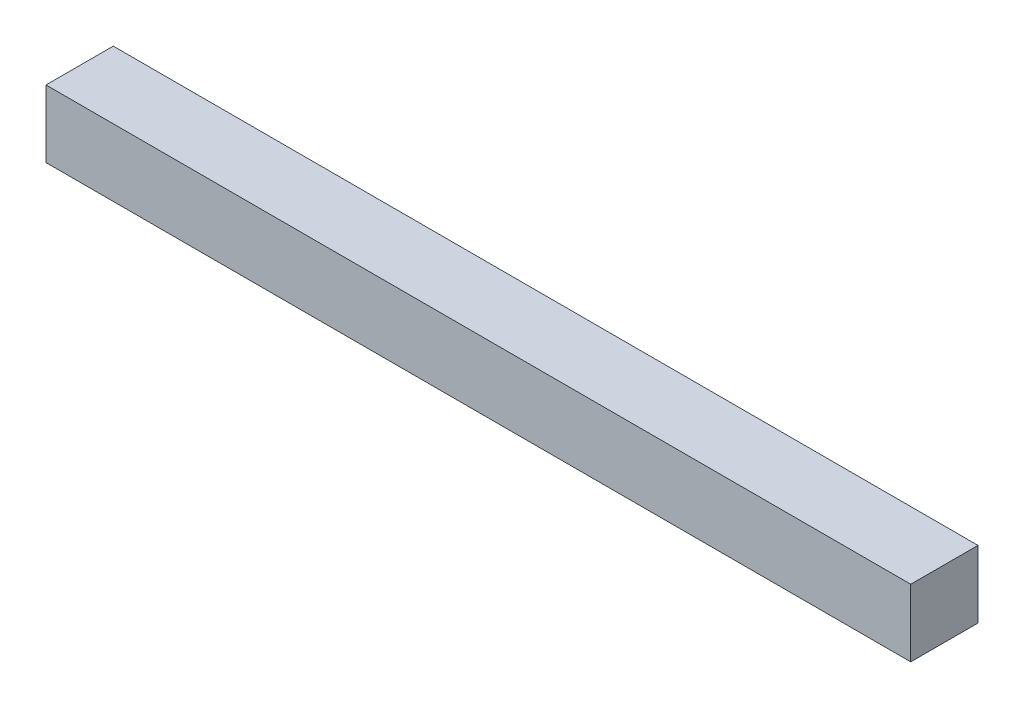
ISO-10303-21;
HEADER;
FILE_DESCRIPTION(('STEP AP214'),'2;1');
FILE_NAME('part.step','',(''),(''),'','','');
FILE_SCHEMA(('AUTOMOTIVE_DESIGN { 1 0 10303 214 1 1 1 1 }'));
ENDSEC;
DATA;
#1=APPLICATION_CONTEXT('core data for automotive mechanical design processes');
#2=APPLICATION_PROTOCOL_DEFINITION('international standard','automotive_design',2000,#1);
#3=PRODUCT_CONTEXT('',#1,'mechanical');
#4=PRODUCT('Part','Part','',(#3));
#5=PRODUCT_RELATED_PRODUCT_CATEGORY('part','',(#4));
#6=PRODUCT_DEFINITION_FORMATION('','',#4);
#7=PRODUCT_DEFINITION_CONTEXT('part definition',#1,'design');
#8=PRODUCT_DEFINITION('design','',#6,#7);
#9=PRODUCT_DEFINITION_SHAPE('','',#8);
#10=(LENGTH_UNIT() NAMED_UNIT(*) SI_UNIT(.MILLI.,.METRE.));
#11=(NAMED_UNIT(*) PLANE_ANGLE_UNIT() SI_UNIT($,.RADIAN.));
#12=(NAMED_UNIT(*) SI_UNIT($,.STERADIAN.) SOLID_ANGLE_UNIT());
#13=UNCERTAINTY_MEASURE_WITH_UNIT(LENGTH_MEASURE(1.E-05),#10,'distance_accuracy_value','');
#14=(GEOMETRIC_REPRESENTATION_CONTEXT(3) GLOBAL_UNCERTAINTY_ASSIGNED_CONTEXT((#13)) GLOBAL_UNIT_ASSIGNED_CONTEXT((#10,
#11,#12)) REPRESENTATION_CONTEXT('',''));
#15=CARTESIAN_POINT('',(0.,0.,0.));
#16=DIRECTION('',(0.,0.,1.));
#17=DIRECTION('',(1.,0.,0.));
#18=AXIS2_PLACEMENT_3D('',#15,#16,#17);
#19=CARTESIAN_POINT('',(326.5693928594,12.7,-12.7));
#20=DIRECTION('',(0.,0.,1.));
#21=DIRECTION('',(0.,-1.,0.));
#22=AXIS2_PLACEMENT_3D('',#19,#20,#21);
#23=PLANE('',#22);
#24=DIRECTION('',(0.,1.,0.));
#25=VECTOR('',#24,1.);
#26=CARTESIAN_POINT('',(0.,12.7,-12.7));
#27=LINE('',#26,#25);
#28=CARTESIAN_POINT('',(0.,-12.7,-12.7));
#29=VERTEX_POINT('',#28);
#30=CARTESIAN_POINT('',(0.,12.7,-12.7));
#31=VERTEX_POINT('',#30);
#32=EDGE_CURVE('E100',#29,#31,#27,.T.);
#33=ORIENTED_EDGE('',*,*,#32,.T.);
#34=DIRECTION('',(-1.,0.,0.));
#35=VECTOR('',#34,1.);
#36=CARTESIAN_POINT('',(326.5693928594,12.7,-12.7));
#37=LINE('',#36,#35);
#38=CARTESIAN_POINT('',(326.5693928594,12.7,-12.7));
#39=VERTEX_POINT('',#38);
#40=EDGE_CURVE('E11',#39,#31,#37,.T.);
#41=ORIENTED_EDGE('',*,*,#40,.F.);
#42=DIRECTION('',(0.,1.,0.));
#43=VECTOR('',#42,1.);
#44=CARTESIAN_POINT('',(326.5693928594,12.7,-12.7));
#45=LINE('',#44,#43);
#46=CARTESIAN_POINT('',(326.5693928594,-12.7,-12.7));
#47=VERTEX_POINT('',#46);
#48=EDGE_CURVE('E88',#47,#39,#45,.T.);
#49=ORIENTED_EDGE('',*,*,#48,.F.);
#50=DIRECTION('',(-1.,0.,0.));
#51=VECTOR('',#50,1.);
#52=CARTESIAN_POINT('',(326.5693928594,-12.7,-12.7));
#53=LINE('',#52,#51);
#54=EDGE_CURVE('E96',#47,#29,#53,.T.);
#55=ORIENTED_EDGE('',*,*,#54,.T.);
#56=EDGE_LOOP('',(#33,#41,#49,#55));
#57=FACE_BOUND('',#56,.T.);
#58=ADVANCED_FACE('F37',(#57),#23,.F.);
#59=CARTESIAN_POINT('',(326.5693928594,12.7,12.7));
#60=DIRECTION('',(0.,-1.,0.));
#61=DIRECTION('',(0.,0.,-1.));
#62=AXIS2_PLACEMENT_3D('',#59,#60,#61);
#63=PLANE('',#62);
#64=DIRECTION('',(0.,0.,1.));
#65=VECTOR('',#64,1.);
#66=CARTESIAN_POINT('',(0.,12.7,12.7));
#67=LINE('',#66,#65);
#68=CARTESIAN_POINT('',(0.,12.7,12.7));
#69=VERTEX_POINT('',#68);
#70=EDGE_CURVE('E92',#31,#69,#67,.T.);
#71=ORIENTED_EDGE('',*,*,#70,.T.);
#72=DIRECTION('',(-1.,0.,0.));
#73=VECTOR('',#72,1.);
#74=CARTESIAN_POINT('',(326.5693928594,12.7,12.7));
#75=LINE('',#74,#73);
#76=CARTESIAN_POINT('',(326.5693928594,12.7,12.7));
#77=VERTEX_POINT('',#76);
#78=EDGE_CURVE('E45',#77,#69,#75,.T.);
#79=ORIENTED_EDGE('',*,*,#78,.F.);
#80=DIRECTION('',(0.,0.,1.));
#81=VECTOR('',#80,1.);
#82=CARTESIAN_POINT('',(326.5693928594,12.7,12.7));
#83=LINE('',#82,#81);
#84=EDGE_CURVE('E83',#39,#77,#83,.T.);
#85=ORIENTED_EDGE('',*,*,#84,.F.);
#86=ORIENTED_EDGE('',*,*,#40,.T.);
#87=EDGE_LOOP('',(#71,#79,#85,#86));
#88=FACE_BOUND('',#87,.T.);
#89=ADVANCED_FACE('F91',(#88),#63,.F.);
#90=CARTESIAN_POINT('',(326.5693928594,12.7,12.7));
#91=DIRECTION('',(0.,0.,-1.));
#92=DIRECTION('',(0.,1.,0.));
#93=AXIS2_PLACEMENT_3D('',#90,#91,#92);
#94=PLANE('',#93);
#95=DIRECTION('',(0.,-1.,0.));
#96=VECTOR('',#95,1.);
#97=CARTESIAN_POINT('',(0.,12.7,12.7));
#98=LINE('',#97,#96);
#99=CARTESIAN_POINT('',(0.,-12.7,12.7));
#100=VERTEX_POINT('',#99);
#101=EDGE_CURVE('E70',#69,#100,#98,.T.);
#102=ORIENTED_EDGE('',*,*,#101,.T.);
#103=DIRECTION('',(-1.,0.,0.));
#104=VECTOR('',#103,1.);
#105=CARTESIAN_POINT('',(326.5693928594,-12.7,12.7));
#106=LINE('',#105,#104);
#107=CARTESIAN_POINT('',(326.5693928594,-12.7,12.7));
#108=VERTEX_POINT('',#107);
#109=EDGE_CURVE('E93',#108,#100,#106,.T.);
#110=ORIENTED_EDGE('',*,*,#109,.F.);
#111=DIRECTION('',(0.,-1.,0.));
#112=VECTOR('',#111,1.);
#113=CARTESIAN_POINT('',(326.5693928594,12.7,12.7));
#114=LINE('',#113,#112);
#115=EDGE_CURVE('E86',#77,#108,#114,.T.);
#116=ORIENTED_EDGE('',*,*,#115,.F.);
#117=ORIENTED_EDGE('',*,*,#78,.T.);
#118=EDGE_LOOP('',(#102,#110,#116,#117));
#119=FACE_BOUND('',#118,.T.);
#120=ADVANCED_FACE('F94',(#119),#94,.F.);
#121=CARTESIAN_POINT('',(326.5693928594,-12.7,12.7));
#122=DIRECTION('',(0.,1.,0.));
#123=DIRECTION('',(0.,0.,1.));
#124=AXIS2_PLACEMENT_3D('',#121,#122,#123);
#125=PLANE('',#124);
#126=DIRECTION('',(0.,0.,-1.));
#127=VECTOR('',#126,1.);
#128=CARTESIAN_POINT('',(0.,-12.7,12.7));
#129=LINE('',#128,#127);
#130=EDGE_CURVE('E76',#100,#29,#129,.T.);
#131=ORIENTED_EDGE('',*,*,#130,.T.);
#132=ORIENTED_EDGE('',*,*,#54,.F.);
#133=DIRECTION('',(0.,0.,-1.));
#134=VECTOR('',#133,1.);
#135=CARTESIAN_POINT('',(326.5693928594,-12.7,12.7));
#136=LINE('',#135,#134);
#137=EDGE_CURVE('E53',#108,#47,#136,.T.);
#138=ORIENTED_EDGE('',*,*,#137,.F.);
#139=ORIENTED_EDGE('',*,*,#109,.T.);
#140=EDGE_LOOP('',(#131,#132,#138,#139));
#141=FACE_BOUND('',#140,.T.);
#142=ADVANCED_FACE('F107',(#141),#125,.F.);
#143=CARTESIAN_POINT('',(326.5693928594,0.,0.));
#144=DIRECTION('',(1.,0.,0.));
#145=DIRECTION('',(0.,0.,-1.));
#146=AXIS2_PLACEMENT_3D('',#143,#144,#145);
#147=PLANE('',#146);
#148=ORIENTED_EDGE('',*,*,#48,.T.);
#149=ORIENTED_EDGE('',*,*,#84,.T.);
#150=ORIENTED_EDGE('',*,*,#115,.T.);
#151=ORIENTED_EDGE('',*,*,#137,.T.);
#152=EDGE_LOOP('',(#148,#149,#150,#151));
#153=FACE_BOUND('',#152,.T.);
#154=ADVANCED_FACE('F84',(#153),#147,.T.);
#155=CARTESIAN_POINT('',(0.,0.,0.));
#156=DIRECTION('',(1.,0.,0.));
#157=DIRECTION('',(0.,0.,-1.));
#158=AXIS2_PLACEMENT_3D('',#155,#156,#157);
#159=PLANE('',#158);
#160=ORIENTED_EDGE('',*,*,#32,.F.);
#161=ORIENTED_EDGE('',*,*,#130,.F.);
#162=ORIENTED_EDGE('',*,*,#101,.F.);
#163=ORIENTED_EDGE('',*,*,#70,.F.);
#164=EDGE_LOOP('',(#160,#161,#162,#163));
#165=FACE_BOUND('',#164,.T.);
#166=ADVANCED_FACE('F110',(#165),#159,.F.);
#167=CLOSED_SHELL('',(#58,#89,#120,#142,#154,#166));
#168=MANIFOLD_SOLID_BREP('B2',#167);
#169=ADVANCED_BREP_SHAPE_REPRESENTATION('',(#18,#168),#14);
#170=SHAPE_DEFINITION_REPRESENTATION(#9,#169);
ENDSEC;
END-ISO-10303-21;
